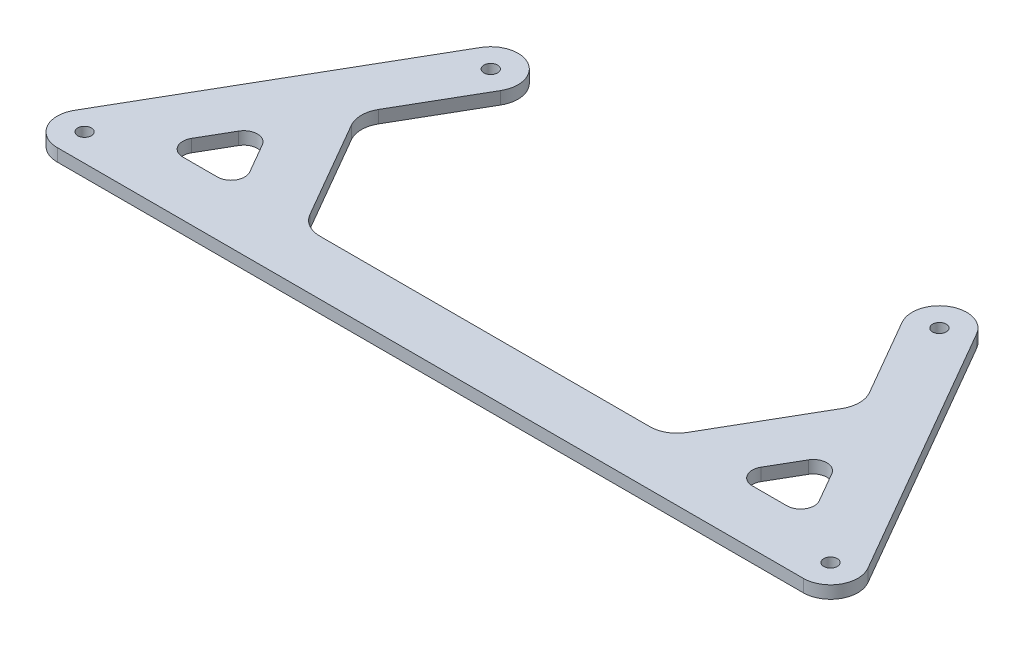
ISO-10303-21;
HEADER;
FILE_DESCRIPTION(('STEP AP214'),'2;1');
FILE_NAME('part.step','',(''),(''),'','','');
FILE_SCHEMA(('AUTOMOTIVE_DESIGN { 1 0 10303 214 1 1 1 1 }'));
ENDSEC;
DATA;
#1=APPLICATION_CONTEXT('core data for automotive mechanical design processes');
#2=APPLICATION_PROTOCOL_DEFINITION('international standard','automotive_design',2000,#1);
#3=PRODUCT_CONTEXT('',#1,'mechanical');
#4=PRODUCT('Part','Part','',(#3));
#5=PRODUCT_RELATED_PRODUCT_CATEGORY('part','',(#4));
#6=PRODUCT_DEFINITION_FORMATION('','',#4);
#7=PRODUCT_DEFINITION_CONTEXT('part definition',#1,'design');
#8=PRODUCT_DEFINITION('design','',#6,#7);
#9=PRODUCT_DEFINITION_SHAPE('','',#8);
#10=(LENGTH_UNIT() NAMED_UNIT(*) SI_UNIT(.MILLI.,.METRE.));
#11=(NAMED_UNIT(*) PLANE_ANGLE_UNIT() SI_UNIT($,.RADIAN.));
#12=(NAMED_UNIT(*) SI_UNIT($,.STERADIAN.) SOLID_ANGLE_UNIT());
#13=UNCERTAINTY_MEASURE_WITH_UNIT(LENGTH_MEASURE(1.E-05),#10,'distance_accuracy_value','');
#14=(GEOMETRIC_REPRESENTATION_CONTEXT(3) GLOBAL_UNCERTAINTY_ASSIGNED_CONTEXT((#13)) GLOBAL_UNIT_ASSIGNED_CONTEXT((#10,
#11,#12)) REPRESENTATION_CONTEXT('',''));
#15=CARTESIAN_POINT('',(0.,0.,0.));
#16=DIRECTION('',(0.,0.,1.));
#17=DIRECTION('',(1.,0.,0.));
#18=AXIS2_PLACEMENT_3D('',#15,#16,#17);
#19=CARTESIAN_POINT('',(173.5081112,5.842,0.));
#20=DIRECTION('',(0.,-1.,0.));
#21=DIRECTION('',(0.,0.,-1.));
#22=AXIS2_PLACEMENT_3D('',#19,#20,#21);
#23=PLANE('',#22);
#24=DIRECTION('',(-0.499999999999978,0.,-0.866025403784452));
#25=VECTOR('',#24,1.);
#26=CARTESIAN_POINT('',(132.461065943876,5.842,-45.6955678841852));
#27=LINE('',#26,#25);
#28=CARTESIAN_POINT('',(146.011804629844,5.842,-22.2249999999975));
#29=VERTEX_POINT('',#28);
#30=CARTESIAN_POINT('',(137.960327257907,5.842,-36.1705678841847));
#31=VERTEX_POINT('',#30);
#32=EDGE_CURVE('E442',#29,#31,#27,.T.);
#33=ORIENTED_EDGE('',*,*,#32,.F.);
#34=CARTESIAN_POINT('',(140.512543315813,5.842,-19.0499999999977));
#35=DIRECTION('',(0.,-1.,0.));
#36=DIRECTION('',(0.,0.,-1.));
#37=AXIS2_PLACEMENT_3D('',#34,#35,#36);
#38=CIRCLE('',#37,6.35);
#39=CARTESIAN_POINT('',(140.512543315813,5.842,-12.6999999999977));
#40=VERTEX_POINT('',#39);
#41=EDGE_CURVE('E290',#29,#40,#38,.T.);
#42=ORIENTED_EDGE('',*,*,#41,.T.);
#43=DIRECTION('',(1.,0.,0.));
#44=VECTOR('',#43,1.);
#45=CARTESIAN_POINT('',(151.511065943875,5.842,-12.6999999999976));
#46=LINE('',#45,#44);
#47=CARTESIAN_POINT('',(124.409588571938,5.842,-12.6999999999978));
#48=VERTEX_POINT('',#47);
#49=EDGE_CURVE('E436',#48,#40,#46,.T.);
#50=ORIENTED_EDGE('',*,*,#49,.F.);
#51=CARTESIAN_POINT('',(124.409588571938,5.842,-19.0499999999978));
#52=DIRECTION('',(0.,-1.,0.));
#53=DIRECTION('',(0.,0.,-1.));
#54=AXIS2_PLACEMENT_3D('',#51,#52,#53);
#55=CIRCLE('',#54,6.35);
#56=CARTESIAN_POINT('',(118.910327257907,5.842,-22.2249999999978));
#57=VERTEX_POINT('',#56);
#58=EDGE_CURVE('E286',#48,#57,#55,.T.);
#59=ORIENTED_EDGE('',*,*,#58,.T.);
#60=DIRECTION('',(-0.499999999999998,0.,0.86602540378444));
#61=VECTOR('',#60,1.);
#62=CARTESIAN_POINT('',(132.461065943876,5.842,-45.6955678841852));
#63=LINE('',#62,#61);
#64=CARTESIAN_POINT('',(126.961804629844,5.842,-36.1705678841848));
#65=VERTEX_POINT('',#64);
#66=EDGE_CURVE('E452',#65,#57,#63,.T.);
#67=ORIENTED_EDGE('',*,*,#66,.F.);
#68=CARTESIAN_POINT('',(132.461065943876,5.842,-32.9955678841849));
#69=DIRECTION('',(0.,-1.,0.));
#70=DIRECTION('',(0.,0.,-1.));
#71=AXIS2_PLACEMENT_3D('',#68,#69,#70);
#72=CIRCLE('',#71,6.35);
#73=EDGE_CURVE('E282',#65,#31,#72,.T.);
#74=ORIENTED_EDGE('',*,*,#73,.T.);
#75=EDGE_LOOP('',(#33,#42,#50,#59,#67,#74));
#76=FACE_BOUND('',#75,.T.);
#77=CARTESIAN_POINT('',(173.5081112,5.842,0.));
#78=DIRECTION('',(0.,1.,0.));
#79=DIRECTION('',(0.,0.,-1.));
#80=AXIS2_PLACEMENT_3D('',#77,#78,#79);
#81=CIRCLE('',#80,12.7);
#82=CARTESIAN_POINT('',(173.5081112,5.842,12.7));
#83=VERTEX_POINT('',#82);
#84=CARTESIAN_POINT('',(184.506633828062,5.842,-6.35000000000005));
#85=VERTEX_POINT('',#84);
#86=EDGE_CURVE('E231',#83,#85,#81,.T.);
#87=ORIENTED_EDGE('',*,*,#86,.T.);
#88=DIRECTION('',(-0.500000000000004,0.,-0.866025403784436));
#89=VECTOR('',#88,1.);
#90=CARTESIAN_POINT('',(115.350561828062,5.842,-126.131830355891));
#91=LINE('',#90,#89);
#92=CARTESIAN_POINT('',(115.350561828062,5.842,-126.131830355891));
#93=VERTEX_POINT('',#92);
#94=EDGE_CURVE('E221',#85,#93,#91,.T.);
#95=ORIENTED_EDGE('',*,*,#94,.T.);
#96=CARTESIAN_POINT('',(104.352039199999,5.842,-119.781830355891));
#97=DIRECTION('',(0.,1.,0.));
#98=DIRECTION('',(0.,0.,-1.));
#99=AXIS2_PLACEMENT_3D('',#96,#97,#98);
#100=CIRCLE('',#99,12.7);
#101=CARTESIAN_POINT('',(93.3535165719371,5.842,-113.431830355891));
#102=VERTEX_POINT('',#101);
#103=EDGE_CURVE('E230',#93,#102,#100,.T.);
#104=ORIENTED_EDGE('',*,*,#103,.T.);
#105=DIRECTION('',(0.500000000000001,0.,0.866025403784438));
#106=VECTOR('',#105,1.);
#107=CARTESIAN_POINT('',(93.3535165719371,5.842,-113.431830355891));
#108=LINE('',#107,#106);
#109=CARTESIAN_POINT('',(114.130194897105,5.842,-77.4455678841852));
#110=VERTEX_POINT('',#109);
#111=EDGE_CURVE('E412',#102,#110,#108,.T.);
#112=ORIENTED_EDGE('',*,*,#111,.T.);
#113=CARTESIAN_POINT('',(103.131672269043,5.842,-71.0955678841852));
#114=DIRECTION('',(0.,-1.,0.));
#115=DIRECTION('',(0.,0.,-1.));
#116=AXIS2_PLACEMENT_3D('',#113,#114,#115);
#117=CIRCLE('',#116,12.7);
#118=CARTESIAN_POINT('',(114.130194897105,5.842,-64.7455678841852));
#119=VERTEX_POINT('',#118);
#120=EDGE_CURVE('E329',#110,#119,#117,.T.);
#121=ORIENTED_EDGE('',*,*,#120,.T.);
#122=DIRECTION('',(-0.5,0.,0.866025403784439));
#123=VECTOR('',#122,1.);
#124=CARTESIAN_POINT('',(117.796369106459,5.842,-71.0955678841852));
#125=LINE('',#124,#123);
#126=CARTESIAN_POINT('',(87.7478464783968,5.842,-19.0499999999981));
#127=VERTEX_POINT('',#126);
#128=EDGE_CURVE('E360',#119,#127,#125,.T.);
#129=ORIENTED_EDGE('',*,*,#128,.T.);
#130=CARTESIAN_POINT('',(76.7493238503344,5.842,-25.3999999999981));
#131=DIRECTION('',(0.,-1.,0.));
#132=DIRECTION('',(0.,0.,-1.));
#133=AXIS2_PLACEMENT_3D('',#130,#131,#132);
#134=CIRCLE('',#133,12.7);
#135=CARTESIAN_POINT('',(76.7493238503344,5.842,-12.6999999999981));
#136=VERTEX_POINT('',#135);
#137=EDGE_CURVE('E57',#127,#136,#134,.T.);
#138=ORIENTED_EDGE('',*,*,#137,.T.);
#139=DIRECTION('',(-1.,0.,0.));
#140=VECTOR('',#139,1.);
#141=CARTESIAN_POINT('',(-84.0816722690426,5.842,-12.6999999999981));
#142=LINE('',#141,#140);
#143=CARTESIAN_POINT('',(-76.7493238503344,5.842,-12.6999999999981));
#144=VERTEX_POINT('',#143);
#145=EDGE_CURVE('E352',#136,#144,#142,.T.);
#146=ORIENTED_EDGE('',*,*,#145,.T.);
#147=CARTESIAN_POINT('',(-76.7493238503344,5.842,-25.399999999998));
#148=DIRECTION('',(0.,-1.,0.));
#149=DIRECTION('',(0.,0.,-1.));
#150=AXIS2_PLACEMENT_3D('',#147,#148,#149);
#151=CIRCLE('',#150,12.7);
#152=CARTESIAN_POINT('',(-87.7478464783968,5.842,-19.0499999999981));
#153=VERTEX_POINT('',#152);
#154=EDGE_CURVE('E11',#144,#153,#151,.T.);
#155=ORIENTED_EDGE('',*,*,#154,.T.);
#156=DIRECTION('',(-0.5,0.,-0.866025403784439));
#157=VECTOR('',#156,1.);
#158=CARTESIAN_POINT('',(-117.796369106459,5.842,-71.0955678841852));
#159=LINE('',#158,#157);
#160=CARTESIAN_POINT('',(-114.130194897105,5.842,-64.7455678841852));
#161=VERTEX_POINT('',#160);
#162=EDGE_CURVE('E350',#153,#161,#159,.T.);
#163=ORIENTED_EDGE('',*,*,#162,.T.);
#164=CARTESIAN_POINT('',(-103.131672269043,5.842,-71.0955678841852));
#165=DIRECTION('',(0.,-1.,0.));
#166=DIRECTION('',(0.,0.,-1.));
#167=AXIS2_PLACEMENT_3D('',#164,#165,#166);
#168=CIRCLE('',#167,12.7);
#169=CARTESIAN_POINT('',(-114.130194897105,5.842,-77.4455678841852));
#170=VERTEX_POINT('',#169);
#171=EDGE_CURVE('E325',#161,#170,#168,.T.);
#172=ORIENTED_EDGE('',*,*,#171,.T.);
#173=DIRECTION('',(0.500000000000001,0.,-0.866025403784438));
#174=VECTOR('',#173,1.);
#175=CARTESIAN_POINT('',(-93.3535165719371,5.842,-113.431830355891));
#176=LINE('',#175,#174);
#177=CARTESIAN_POINT('',(-93.3535165719372,5.842,-113.431830355891));
#178=VERTEX_POINT('',#177);
#179=EDGE_CURVE('E356',#170,#178,#176,.T.);
#180=ORIENTED_EDGE('',*,*,#179,.T.);
#181=CARTESIAN_POINT('',(-104.352039199999,5.842,-119.781830355891));
#182=DIRECTION('',(0.,1.,0.));
#183=DIRECTION('',(0.,0.,1.));
#184=AXIS2_PLACEMENT_3D('',#181,#182,#183);
#185=CIRCLE('',#184,12.7);
#186=CARTESIAN_POINT('',(-115.350561828062,5.842,-126.131830355891));
#187=VERTEX_POINT('',#186);
#188=EDGE_CURVE('E358',#178,#187,#185,.T.);
#189=ORIENTED_EDGE('',*,*,#188,.T.);
#190=DIRECTION('',(-0.500000000000004,0.,0.866025403784437));
#191=VECTOR('',#190,1.);
#192=CARTESIAN_POINT('',(-115.350561828062,5.842,-126.131830355891));
#193=LINE('',#192,#191);
#194=CARTESIAN_POINT('',(-184.506633828062,5.842,-6.35000000000002));
#195=VERTEX_POINT('',#194);
#196=EDGE_CURVE('E365',#187,#195,#193,.T.);
#197=ORIENTED_EDGE('',*,*,#196,.T.);
#198=CARTESIAN_POINT('',(-173.5081112,5.842,0.));
#199=DIRECTION('',(0.,1.,0.));
#200=DIRECTION('',(0.,0.,1.));
#201=AXIS2_PLACEMENT_3D('',#198,#199,#200);
#202=CIRCLE('',#201,12.7);
#203=CARTESIAN_POINT('',(-173.5081112,5.842,12.7));
#204=VERTEX_POINT('',#203);
#205=EDGE_CURVE('E367',#195,#204,#202,.T.);
#206=ORIENTED_EDGE('',*,*,#205,.T.);
#207=DIRECTION('',(1.,0.,0.));
#208=VECTOR('',#207,1.);
#209=CARTESIAN_POINT('',(-173.5081112,5.842,12.7));
#210=LINE('',#209,#208);
#211=EDGE_CURVE('E236',#204,#83,#210,.T.);
#212=ORIENTED_EDGE('',*,*,#211,.T.);
#213=EDGE_LOOP('',(#87,#95,#104,#112,#121,#129,#138,#146,#155,#163,#172,#180,#189,#197,#206,#212));
#214=FACE_BOUND('',#213,.T.);
#215=CARTESIAN_POINT('',(-173.5081112,5.842,0.));
#216=DIRECTION('',(0.,1.,0.));
#217=DIRECTION('',(0.,0.,1.));
#218=AXIS2_PLACEMENT_3D('',#215,#216,#217);
#219=CIRCLE('',#218,3.175);
#220=CARTESIAN_POINT('',(-173.5081112,5.842,3.175));
#221=VERTEX_POINT('',#220);
#222=EDGE_CURVE('E373',#221,#221,#219,.T.);
#223=ORIENTED_EDGE('',*,*,#222,.F.);
#224=EDGE_LOOP('',(#223));
#225=FACE_BOUND('',#224,.T.);
#226=CARTESIAN_POINT('',(-104.352039199999,5.842,-119.781830355891));
#227=DIRECTION('',(0.,1.,0.));
#228=DIRECTION('',(0.,0.,1.));
#229=AXIS2_PLACEMENT_3D('',#226,#227,#228);
#230=CIRCLE('',#229,3.17500000000003);
#231=CARTESIAN_POINT('',(-104.352039199999,5.842,-116.606830355891));
#232=VERTEX_POINT('',#231);
#233=EDGE_CURVE('E430',#232,#232,#230,.T.);
#234=ORIENTED_EDGE('',*,*,#233,.F.);
#235=EDGE_LOOP('',(#234));
#236=FACE_BOUND('',#235,.T.);
#237=DIRECTION('',(-0.499999999999978,0.,0.866025403784452));
#238=VECTOR('',#237,1.);
#239=CARTESIAN_POINT('',(-132.461065943876,5.842,-45.6955678841852));
#240=LINE('',#239,#238);
#241=CARTESIAN_POINT('',(-137.960327257907,5.842,-36.1705678841847));
#242=VERTEX_POINT('',#241);
#243=CARTESIAN_POINT('',(-146.011804629844,5.842,-22.2249999999975));
#244=VERTEX_POINT('',#243);
#245=EDGE_CURVE('E460',#242,#244,#240,.T.);
#246=ORIENTED_EDGE('',*,*,#245,.F.);
#247=CARTESIAN_POINT('',(-132.461065943876,5.842,-32.9955678841848));
#248=DIRECTION('',(0.,-1.,0.));
#249=DIRECTION('',(0.,0.,-1.));
#250=AXIS2_PLACEMENT_3D('',#247,#248,#249);
#251=CIRCLE('',#250,6.35);
#252=CARTESIAN_POINT('',(-126.961804629844,5.842,-36.1705678841848));
#253=VERTEX_POINT('',#252);
#254=EDGE_CURVE('E302',#242,#253,#251,.T.);
#255=ORIENTED_EDGE('',*,*,#254,.T.);
#256=DIRECTION('',(-0.499999999999997,0.,-0.86602540378444));
#257=VECTOR('',#256,1.);
#258=CARTESIAN_POINT('',(-132.461065943876,5.842,-45.6955678841852));
#259=LINE('',#258,#257);
#260=CARTESIAN_POINT('',(-118.910327257907,5.842,-22.2249999999977));
#261=VERTEX_POINT('',#260);
#262=EDGE_CURVE('E449',#261,#253,#259,.T.);
#263=ORIENTED_EDGE('',*,*,#262,.F.);
#264=CARTESIAN_POINT('',(-124.409588571938,5.842,-19.0499999999978));
#265=DIRECTION('',(0.,-1.,0.));
#266=DIRECTION('',(0.,0.,-1.));
#267=AXIS2_PLACEMENT_3D('',#264,#265,#266);
#268=CIRCLE('',#267,6.35);
#269=CARTESIAN_POINT('',(-124.409588571938,5.842,-12.6999999999978));
#270=VERTEX_POINT('',#269);
#271=EDGE_CURVE('E294',#261,#270,#268,.T.);
#272=ORIENTED_EDGE('',*,*,#271,.T.);
#273=DIRECTION('',(1.,0.,0.));
#274=VECTOR('',#273,1.);
#275=CARTESIAN_POINT('',(-151.511065943875,5.842,-12.6999999999976));
#276=LINE('',#275,#274);
#277=CARTESIAN_POINT('',(-140.512543315813,5.842,-12.6999999999976));
#278=VERTEX_POINT('',#277);
#279=EDGE_CURVE('E470',#278,#270,#276,.T.);
#280=ORIENTED_EDGE('',*,*,#279,.F.);
#281=CARTESIAN_POINT('',(-140.512543315813,5.842,-19.0499999999976));
#282=DIRECTION('',(0.,-1.,0.));
#283=DIRECTION('',(0.,0.,-1.));
#284=AXIS2_PLACEMENT_3D('',#281,#282,#283);
#285=CIRCLE('',#284,6.35);
#286=EDGE_CURVE('E298',#278,#244,#285,.T.);
#287=ORIENTED_EDGE('',*,*,#286,.T.);
#288=EDGE_LOOP('',(#246,#255,#263,#272,#280,#287));
#289=FACE_BOUND('',#288,.T.);
#290=CARTESIAN_POINT('',(104.352039199999,5.842,-119.781830355891));
#291=DIRECTION('',(0.,1.,0.));
#292=DIRECTION('',(0.,0.,-1.));
#293=AXIS2_PLACEMENT_3D('',#290,#291,#292);
#294=CIRCLE('',#293,3.175);
#295=CARTESIAN_POINT('',(104.352039199999,5.842,-122.956830355891));
#296=VERTEX_POINT('',#295);
#297=EDGE_CURVE('E467',#296,#296,#294,.T.);
#298=ORIENTED_EDGE('',*,*,#297,.F.);
#299=EDGE_LOOP('',(#298));
#300=FACE_BOUND('',#299,.T.);
#301=CARTESIAN_POINT('',(173.5081112,5.842,0.));
#302=DIRECTION('',(0.,1.,0.));
#303=DIRECTION('',(0.,0.,-1.));
#304=AXIS2_PLACEMENT_3D('',#301,#302,#303);
#305=CIRCLE('',#304,3.17499999999996);
#306=CARTESIAN_POINT('',(173.5081112,5.842,-3.17499999999996));
#307=VERTEX_POINT('',#306);
#308=EDGE_CURVE('E478',#307,#307,#305,.T.);
#309=ORIENTED_EDGE('',*,*,#308,.F.);
#310=EDGE_LOOP('',(#309));
#311=FACE_BOUND('',#310,.T.);
#312=ADVANCED_FACE('F35',(#76,#214,#225,#236,#289,#300,#311),#23,.F.);
#313=CARTESIAN_POINT('',(173.5081112,0.,0.));
#314=DIRECTION('',(0.,-1.,0.));
#315=DIRECTION('',(0.,0.,-1.));
#316=AXIS2_PLACEMENT_3D('',#313,#314,#315);
#317=PLANE('',#316);
#318=CARTESIAN_POINT('',(104.352039199999,0.,-119.781830355891));
#319=DIRECTION('',(0.,1.,0.));
#320=DIRECTION('',(0.,0.,-1.));
#321=AXIS2_PLACEMENT_3D('',#318,#319,#320);
#322=CIRCLE('',#321,3.175);
#323=CARTESIAN_POINT('',(104.352039199999,0.,-122.956830355891));
#324=VERTEX_POINT('',#323);
#325=EDGE_CURVE('E475',#324,#324,#322,.T.);
#326=ORIENTED_EDGE('',*,*,#325,.T.);
#327=EDGE_LOOP('',(#326));
#328=FACE_BOUND('',#327,.T.);
#329=CARTESIAN_POINT('',(-173.5081112,0.,0.));
#330=DIRECTION('',(0.,1.,0.));
#331=DIRECTION('',(0.,0.,1.));
#332=AXIS2_PLACEMENT_3D('',#329,#330,#331);
#333=CIRCLE('',#332,3.175);
#334=CARTESIAN_POINT('',(-173.5081112,0.,3.175));
#335=VERTEX_POINT('',#334);
#336=EDGE_CURVE('E427',#335,#335,#333,.T.);
#337=ORIENTED_EDGE('',*,*,#336,.T.);
#338=EDGE_LOOP('',(#337));
#339=FACE_BOUND('',#338,.T.);
#340=CARTESIAN_POINT('',(173.5081112,0.,0.));
#341=DIRECTION('',(0.,1.,0.));
#342=DIRECTION('',(0.,0.,-1.));
#343=AXIS2_PLACEMENT_3D('',#340,#341,#342);
#344=CIRCLE('',#343,12.7);
#345=CARTESIAN_POINT('',(173.5081112,0.,12.7));
#346=VERTEX_POINT('',#345);
#347=CARTESIAN_POINT('',(184.506633828062,0.,-6.35000000000005));
#348=VERTEX_POINT('',#347);
#349=EDGE_CURVE('E244',#346,#348,#344,.T.);
#350=ORIENTED_EDGE('',*,*,#349,.F.);
#351=DIRECTION('',(1.,0.,0.));
#352=VECTOR('',#351,1.);
#353=CARTESIAN_POINT('',(-173.5081112,0.,12.7));
#354=LINE('',#353,#352);
#355=CARTESIAN_POINT('',(-173.5081112,0.,12.7));
#356=VERTEX_POINT('',#355);
#357=EDGE_CURVE('E240',#356,#346,#354,.T.);
#358=ORIENTED_EDGE('',*,*,#357,.F.);
#359=CARTESIAN_POINT('',(-173.5081112,0.,0.));
#360=DIRECTION('',(0.,1.,0.));
#361=DIRECTION('',(0.,0.,1.));
#362=AXIS2_PLACEMENT_3D('',#359,#360,#361);
#363=CIRCLE('',#362,12.7);
#364=CARTESIAN_POINT('',(-184.506633828062,0.,-6.35000000000002));
#365=VERTEX_POINT('',#364);
#366=EDGE_CURVE('E389',#365,#356,#363,.T.);
#367=ORIENTED_EDGE('',*,*,#366,.F.);
#368=DIRECTION('',(-0.500000000000004,0.,0.866025403784437));
#369=VECTOR('',#368,1.);
#370=CARTESIAN_POINT('',(-115.350561828062,0.,-126.131830355891));
#371=LINE('',#370,#369);
#372=CARTESIAN_POINT('',(-115.350561828062,0.,-126.131830355891));
#373=VERTEX_POINT('',#372);
#374=EDGE_CURVE('E387',#373,#365,#371,.T.);
#375=ORIENTED_EDGE('',*,*,#374,.F.);
#376=CARTESIAN_POINT('',(-104.352039199999,0.,-119.781830355891));
#377=DIRECTION('',(0.,1.,0.));
#378=DIRECTION('',(0.,0.,1.));
#379=AXIS2_PLACEMENT_3D('',#376,#377,#378);
#380=CIRCLE('',#379,12.7);
#381=CARTESIAN_POINT('',(-93.3535165719372,0.,-113.431830355891));
#382=VERTEX_POINT('',#381);
#383=EDGE_CURVE('E385',#382,#373,#380,.T.);
#384=ORIENTED_EDGE('',*,*,#383,.F.);
#385=DIRECTION('',(0.500000000000001,0.,-0.866025403784438));
#386=VECTOR('',#385,1.);
#387=CARTESIAN_POINT('',(-93.3535165719371,0.,-113.431830355891));
#388=LINE('',#387,#386);
#389=CARTESIAN_POINT('',(-114.130194897105,0.,-77.4455678841852));
#390=VERTEX_POINT('',#389);
#391=EDGE_CURVE('E383',#390,#382,#388,.T.);
#392=ORIENTED_EDGE('',*,*,#391,.F.);
#393=CARTESIAN_POINT('',(-103.131672269043,0.,-71.0955678841852));
#394=DIRECTION('',(0.,-1.,0.));
#395=DIRECTION('',(0.,0.,-1.));
#396=AXIS2_PLACEMENT_3D('',#393,#394,#395);
#397=CIRCLE('',#396,12.7);
#398=CARTESIAN_POINT('',(-114.130194897105,0.,-64.7455678841852));
#399=VERTEX_POINT('',#398);
#400=EDGE_CURVE('E323',#390,#399,#397,.F.);
#401=ORIENTED_EDGE('',*,*,#400,.T.);
#402=DIRECTION('',(-0.5,0.,-0.866025403784439));
#403=VECTOR('',#402,1.);
#404=CARTESIAN_POINT('',(-117.796369106459,0.,-71.0955678841852));
#405=LINE('',#404,#403);
#406=CARTESIAN_POINT('',(-87.7478464783968,0.,-19.0499999999981));
#407=VERTEX_POINT('',#406);
#408=EDGE_CURVE('E340',#407,#399,#405,.T.);
#409=ORIENTED_EDGE('',*,*,#408,.F.);
#410=CARTESIAN_POINT('',(-76.7493238503344,0.,-25.399999999998));
#411=DIRECTION('',(0.,-1.,0.));
#412=DIRECTION('',(0.,0.,-1.));
#413=AXIS2_PLACEMENT_3D('',#410,#411,#412);
#414=CIRCLE('',#413,12.7);
#415=CARTESIAN_POINT('',(-76.7493238503344,0.,-12.6999999999981));
#416=VERTEX_POINT('',#415);
#417=EDGE_CURVE('E43',#407,#416,#414,.F.);
#418=ORIENTED_EDGE('',*,*,#417,.T.);
#419=DIRECTION('',(-1.,0.,0.));
#420=VECTOR('',#419,1.);
#421=CARTESIAN_POINT('',(-84.0816722690426,0.,-12.6999999999981));
#422=LINE('',#421,#420);
#423=CARTESIAN_POINT('',(76.7493238503344,0.,-12.6999999999981));
#424=VERTEX_POINT('',#423);
#425=EDGE_CURVE('E338',#424,#416,#422,.T.);
#426=ORIENTED_EDGE('',*,*,#425,.F.);
#427=CARTESIAN_POINT('',(76.7493238503344,0.,-25.3999999999981));
#428=DIRECTION('',(0.,-1.,0.));
#429=DIRECTION('',(0.,0.,-1.));
#430=AXIS2_PLACEMENT_3D('',#427,#428,#429);
#431=CIRCLE('',#430,12.7);
#432=CARTESIAN_POINT('',(87.7478464783968,0.,-19.0499999999981));
#433=VERTEX_POINT('',#432);
#434=EDGE_CURVE('E331',#424,#433,#431,.F.);
#435=ORIENTED_EDGE('',*,*,#434,.T.);
#436=DIRECTION('',(-0.5,0.,0.866025403784439));
#437=VECTOR('',#436,1.);
#438=CARTESIAN_POINT('',(117.796369106459,0.,-71.0955678841852));
#439=LINE('',#438,#437);
#440=CARTESIAN_POINT('',(114.130194897105,0.,-64.7455678841852));
#441=VERTEX_POINT('',#440);
#442=EDGE_CURVE('E345',#441,#433,#439,.T.);
#443=ORIENTED_EDGE('',*,*,#442,.F.);
#444=CARTESIAN_POINT('',(103.131672269043,0.,-71.0955678841852));
#445=DIRECTION('',(0.,-1.,0.));
#446=DIRECTION('',(0.,0.,-1.));
#447=AXIS2_PLACEMENT_3D('',#444,#445,#446);
#448=CIRCLE('',#447,12.7);
#449=CARTESIAN_POINT('',(114.130194897105,0.,-77.4455678841852));
#450=VERTEX_POINT('',#449);
#451=EDGE_CURVE('E327',#441,#450,#448,.F.);
#452=ORIENTED_EDGE('',*,*,#451,.T.);
#453=DIRECTION('',(0.500000000000001,0.,0.866025403784438));
#454=VECTOR('',#453,1.);
#455=CARTESIAN_POINT('',(93.3535165719371,0.,-113.431830355891));
#456=LINE('',#455,#454);
#457=CARTESIAN_POINT('',(93.3535165719371,0.,-113.431830355891));
#458=VERTEX_POINT('',#457);
#459=EDGE_CURVE('E377',#458,#450,#456,.T.);
#460=ORIENTED_EDGE('',*,*,#459,.F.);
#461=CARTESIAN_POINT('',(104.352039199999,0.,-119.781830355891));
#462=DIRECTION('',(0.,1.,0.));
#463=DIRECTION('',(0.,0.,-1.));
#464=AXIS2_PLACEMENT_3D('',#461,#462,#463);
#465=CIRCLE('',#464,12.7);
#466=CARTESIAN_POINT('',(115.350561828062,0.,-126.131830355891));
#467=VERTEX_POINT('',#466);
#468=EDGE_CURVE('E375',#467,#458,#465,.T.);
#469=ORIENTED_EDGE('',*,*,#468,.F.);
#470=DIRECTION('',(-0.500000000000004,0.,-0.866025403784436));
#471=VECTOR('',#470,1.);
#472=CARTESIAN_POINT('',(115.350561828062,0.,-126.131830355891));
#473=LINE('',#472,#471);
#474=EDGE_CURVE('E372',#348,#467,#473,.T.);
#475=ORIENTED_EDGE('',*,*,#474,.F.);
#476=EDGE_LOOP('',(#350,#358,#367,#375,#384,#392,#401,#409,#418,#426,#435,#443,#452,#460,#469,#475));
#477=FACE_BOUND('',#476,.T.);
#478=CARTESIAN_POINT('',(-104.352039199999,0.,-119.781830355891));
#479=DIRECTION('',(0.,1.,0.));
#480=DIRECTION('',(0.,0.,1.));
#481=AXIS2_PLACEMENT_3D('',#478,#479,#480);
#482=CIRCLE('',#481,3.17500000000003);
#483=CARTESIAN_POINT('',(-104.352039199999,0.,-116.606830355891));
#484=VERTEX_POINT('',#483);
#485=EDGE_CURVE('E433',#484,#484,#482,.T.);
#486=ORIENTED_EDGE('',*,*,#485,.T.);
#487=EDGE_LOOP('',(#486));
#488=FACE_BOUND('',#487,.T.);
#489=DIRECTION('',(-0.499999999999998,0.,0.86602540378444));
#490=VECTOR('',#489,1.);
#491=CARTESIAN_POINT('',(132.461065943876,0.,-45.6955678841852));
#492=LINE('',#491,#490);
#493=CARTESIAN_POINT('',(126.961804629844,0.,-36.1705678841848));
#494=VERTEX_POINT('',#493);
#495=CARTESIAN_POINT('',(118.910327257907,0.,-22.2249999999978));
#496=VERTEX_POINT('',#495);
#497=EDGE_CURVE('E443',#494,#496,#492,.T.);
#498=ORIENTED_EDGE('',*,*,#497,.T.);
#499=CARTESIAN_POINT('',(124.409588571938,0.,-19.0499999999978));
#500=DIRECTION('',(0.,-1.,0.));
#501=DIRECTION('',(0.,0.,-1.));
#502=AXIS2_PLACEMENT_3D('',#499,#500,#501);
#503=CIRCLE('',#502,6.35);
#504=CARTESIAN_POINT('',(124.409588571938,0.,-12.6999999999978));
#505=VERTEX_POINT('',#504);
#506=EDGE_CURVE('E284',#496,#505,#503,.F.);
#507=ORIENTED_EDGE('',*,*,#506,.T.);
#508=DIRECTION('',(1.,0.,0.));
#509=VECTOR('',#508,1.);
#510=CARTESIAN_POINT('',(151.511065943875,0.,-12.6999999999976));
#511=LINE('',#510,#509);
#512=CARTESIAN_POINT('',(140.512543315813,0.,-12.6999999999977));
#513=VERTEX_POINT('',#512);
#514=EDGE_CURVE('E439',#505,#513,#511,.T.);
#515=ORIENTED_EDGE('',*,*,#514,.T.);
#516=CARTESIAN_POINT('',(140.512543315813,0.,-19.0499999999977));
#517=DIRECTION('',(0.,-1.,0.));
#518=DIRECTION('',(0.,0.,-1.));
#519=AXIS2_PLACEMENT_3D('',#516,#517,#518);
#520=CIRCLE('',#519,6.35);
#521=CARTESIAN_POINT('',(146.011804629844,0.,-22.2249999999975));
#522=VERTEX_POINT('',#521);
#523=EDGE_CURVE('E288',#513,#522,#520,.F.);
#524=ORIENTED_EDGE('',*,*,#523,.T.);
#525=DIRECTION('',(-0.499999999999978,0.,-0.866025403784452));
#526=VECTOR('',#525,1.);
#527=CARTESIAN_POINT('',(132.461065943876,0.,-45.6955678841852));
#528=LINE('',#527,#526);
#529=CARTESIAN_POINT('',(137.960327257907,0.,-36.1705678841847));
#530=VERTEX_POINT('',#529);
#531=EDGE_CURVE('E446',#522,#530,#528,.T.);
#532=ORIENTED_EDGE('',*,*,#531,.T.);
#533=CARTESIAN_POINT('',(132.461065943876,0.,-32.9955678841849));
#534=DIRECTION('',(0.,-1.,0.));
#535=DIRECTION('',(0.,0.,-1.));
#536=AXIS2_PLACEMENT_3D('',#533,#534,#535);
#537=CIRCLE('',#536,6.35);
#538=EDGE_CURVE('E280',#530,#494,#537,.F.);
#539=ORIENTED_EDGE('',*,*,#538,.T.);
#540=EDGE_LOOP('',(#498,#507,#515,#524,#532,#539));
#541=FACE_BOUND('',#540,.T.);
#542=DIRECTION('',(1.,0.,0.));
#543=VECTOR('',#542,1.);
#544=CARTESIAN_POINT('',(-151.511065943875,0.,-12.6999999999976));
#545=LINE('',#544,#543);
#546=CARTESIAN_POINT('',(-140.512543315813,0.,-12.6999999999976));
#547=VERTEX_POINT('',#546);
#548=CARTESIAN_POINT('',(-124.409588571938,0.,-12.6999999999978));
#549=VERTEX_POINT('',#548);
#550=EDGE_CURVE('E461',#547,#549,#545,.T.);
#551=ORIENTED_EDGE('',*,*,#550,.T.);
#552=CARTESIAN_POINT('',(-124.409588571938,0.,-19.0499999999978));
#553=DIRECTION('',(0.,-1.,0.));
#554=DIRECTION('',(0.,0.,-1.));
#555=AXIS2_PLACEMENT_3D('',#552,#553,#554);
#556=CIRCLE('',#555,6.35);
#557=CARTESIAN_POINT('',(-118.910327257907,0.,-22.2249999999977));
#558=VERTEX_POINT('',#557);
#559=EDGE_CURVE('E292',#549,#558,#556,.F.);
#560=ORIENTED_EDGE('',*,*,#559,.T.);
#561=DIRECTION('',(-0.499999999999997,0.,-0.86602540378444));
#562=VECTOR('',#561,1.);
#563=CARTESIAN_POINT('',(-132.461065943876,0.,-45.6955678841852));
#564=LINE('',#563,#562);
#565=CARTESIAN_POINT('',(-126.961804629844,0.,-36.1705678841848));
#566=VERTEX_POINT('',#565);
#567=EDGE_CURVE('E457',#558,#566,#564,.T.);
#568=ORIENTED_EDGE('',*,*,#567,.T.);
#569=CARTESIAN_POINT('',(-132.461065943876,0.,-32.9955678841848));
#570=DIRECTION('',(0.,-1.,0.));
#571=DIRECTION('',(0.,0.,-1.));
#572=AXIS2_PLACEMENT_3D('',#569,#570,#571);
#573=CIRCLE('',#572,6.35);
#574=CARTESIAN_POINT('',(-137.960327257907,0.,-36.1705678841847));
#575=VERTEX_POINT('',#574);
#576=EDGE_CURVE('E300',#566,#575,#573,.F.);
#577=ORIENTED_EDGE('',*,*,#576,.T.);
#578=DIRECTION('',(-0.499999999999978,0.,0.866025403784452));
#579=VECTOR('',#578,1.);
#580=CARTESIAN_POINT('',(-132.461065943876,0.,-45.6955678841852));
#581=LINE('',#580,#579);
#582=CARTESIAN_POINT('',(-146.011804629844,0.,-22.2249999999975));
#583=VERTEX_POINT('',#582);
#584=EDGE_CURVE('E464',#575,#583,#581,.T.);
#585=ORIENTED_EDGE('',*,*,#584,.T.);
#586=CARTESIAN_POINT('',(-140.512543315813,0.,-19.0499999999976));
#587=DIRECTION('',(0.,-1.,0.));
#588=DIRECTION('',(0.,0.,-1.));
#589=AXIS2_PLACEMENT_3D('',#586,#587,#588);
#590=CIRCLE('',#589,6.35);
#591=EDGE_CURVE('E296',#583,#547,#590,.F.);
#592=ORIENTED_EDGE('',*,*,#591,.T.);
#593=EDGE_LOOP('',(#551,#560,#568,#577,#585,#592));
#594=FACE_BOUND('',#593,.T.);
#595=CARTESIAN_POINT('',(173.5081112,0.,0.));
#596=DIRECTION('',(0.,1.,0.));
#597=DIRECTION('',(0.,0.,-1.));
#598=AXIS2_PLACEMENT_3D('',#595,#596,#597);
#599=CIRCLE('',#598,3.17499999999996);
#600=CARTESIAN_POINT('',(173.5081112,0.,-3.17499999999996));
#601=VERTEX_POINT('',#600);
#602=EDGE_CURVE('E481',#601,#601,#599,.T.);
#603=ORIENTED_EDGE('',*,*,#602,.T.);
#604=EDGE_LOOP('',(#603));
#605=FACE_BOUND('',#604,.T.);
#606=ADVANCED_FACE('F336',(#328,#339,#477,#488,#541,#594,#605),#317,.T.);
#607=CARTESIAN_POINT('',(173.5081112,5.842,0.));
#608=DIRECTION('',(0.,-1.,0.));
#609=DIRECTION('',(0.,0.,-1.));
#610=AXIS2_PLACEMENT_3D('',#607,#608,#609);
#611=CYLINDRICAL_SURFACE('',#610,12.7);
#612=ORIENTED_EDGE('',*,*,#349,.T.);
#613=DIRECTION('',(0.,-1.,0.));
#614=VECTOR('',#613,1.);
#615=CARTESIAN_POINT('',(184.506633828062,5.842,-6.35000000000005));
#616=LINE('',#615,#614);
#617=EDGE_CURVE('E225',#85,#348,#616,.T.);
#618=ORIENTED_EDGE('',*,*,#617,.F.);
#619=ORIENTED_EDGE('',*,*,#86,.F.);
#620=DIRECTION('',(0.,-1.,0.));
#621=VECTOR('',#620,1.);
#622=CARTESIAN_POINT('',(173.5081112,5.842,12.7));
#623=LINE('',#622,#621);
#624=EDGE_CURVE('E370',#83,#346,#623,.T.);
#625=ORIENTED_EDGE('',*,*,#624,.T.);
#626=EDGE_LOOP('',(#612,#618,#619,#625));
#627=FACE_BOUND('',#626,.T.);
#628=ADVANCED_FACE('F242',(#627),#611,.T.);
#629=CARTESIAN_POINT('',(115.350561828062,5.842,-126.131830355891));
#630=DIRECTION('',(-0.866025403784436,0.,0.500000000000004));
#631=DIRECTION('',(0.500000000000004,0.,0.866025403784436));
#632=AXIS2_PLACEMENT_3D('',#629,#630,#631);
#633=PLANE('',#632);
#634=ORIENTED_EDGE('',*,*,#474,.T.);
#635=DIRECTION('',(0.,-1.,0.));
#636=VECTOR('',#635,1.);
#637=CARTESIAN_POINT('',(115.350561828062,5.842,-126.131830355891));
#638=LINE('',#637,#636);
#639=EDGE_CURVE('E228',#93,#467,#638,.T.);
#640=ORIENTED_EDGE('',*,*,#639,.F.);
#641=ORIENTED_EDGE('',*,*,#94,.F.);
#642=ORIENTED_EDGE('',*,*,#617,.T.);
#643=EDGE_LOOP('',(#634,#640,#641,#642));
#644=FACE_BOUND('',#643,.T.);
#645=ADVANCED_FACE('F223',(#644),#633,.F.);
#646=CARTESIAN_POINT('',(104.352039199999,5.842,-119.781830355891));
#647=DIRECTION('',(0.,-1.,0.));
#648=DIRECTION('',(0.,0.,-1.));
#649=AXIS2_PLACEMENT_3D('',#646,#647,#648);
#650=CYLINDRICAL_SURFACE('',#649,12.7);
#651=ORIENTED_EDGE('',*,*,#468,.T.);
#652=DIRECTION('',(0.,-1.,0.));
#653=VECTOR('',#652,1.);
#654=CARTESIAN_POINT('',(93.3535165719371,5.842,-113.431830355891));
#655=LINE('',#654,#653);
#656=EDGE_CURVE('E249',#102,#458,#655,.T.);
#657=ORIENTED_EDGE('',*,*,#656,.F.);
#658=ORIENTED_EDGE('',*,*,#103,.F.);
#659=ORIENTED_EDGE('',*,*,#639,.T.);
#660=EDGE_LOOP('',(#651,#657,#658,#659));
#661=FACE_BOUND('',#660,.T.);
#662=ADVANCED_FACE('F531',(#661),#650,.T.);
#663=CARTESIAN_POINT('',(93.3535165719371,5.842,-113.431830355891));
#664=DIRECTION('',(0.866025403784438,0.,-0.500000000000001));
#665=DIRECTION('',(-0.500000000000001,0.,-0.866025403784438));
#666=AXIS2_PLACEMENT_3D('',#663,#664,#665);
#667=PLANE('',#666);
#668=ORIENTED_EDGE('',*,*,#459,.T.);
#669=DIRECTION('',(0.,-1.,0.));
#670=VECTOR('',#669,1.);
#671=CARTESIAN_POINT('',(114.130194897105,5.842,-77.4455678841852));
#672=LINE('',#671,#670);
#673=EDGE_CURVE('E317',#450,#110,#672,.F.);
#674=ORIENTED_EDGE('',*,*,#673,.T.);
#675=ORIENTED_EDGE('',*,*,#111,.F.);
#676=ORIENTED_EDGE('',*,*,#656,.T.);
#677=EDGE_LOOP('',(#668,#674,#675,#676));
#678=FACE_BOUND('',#677,.T.);
#679=ADVANCED_FACE('F409',(#678),#667,.F.);
#680=CARTESIAN_POINT('',(117.796369106459,5.842,-71.0955678841852));
#681=DIRECTION('',(0.866025403784439,0.,0.5));
#682=DIRECTION('',(0.5,0.,-0.866025403784439));
#683=AXIS2_PLACEMENT_3D('',#680,#681,#682);
#684=PLANE('',#683);
#685=ORIENTED_EDGE('',*,*,#128,.F.);
#686=DIRECTION('',(0.,-1.,0.));
#687=VECTOR('',#686,1.);
#688=CARTESIAN_POINT('',(114.130194897105,0.,-64.7455678841852));
#689=LINE('',#688,#687);
#690=EDGE_CURVE('E314',#119,#441,#689,.T.);
#691=ORIENTED_EDGE('',*,*,#690,.T.);
#692=ORIENTED_EDGE('',*,*,#442,.T.);
#693=DIRECTION('',(0.,-1.,0.));
#694=VECTOR('',#693,1.);
#695=CARTESIAN_POINT('',(87.7478464783968,5.842,-19.0499999999981));
#696=LINE('',#695,#694);
#697=EDGE_CURVE('E312',#433,#127,#696,.F.);
#698=ORIENTED_EDGE('',*,*,#697,.T.);
#699=EDGE_LOOP('',(#685,#691,#692,#698));
#700=FACE_BOUND('',#699,.T.);
#701=ADVANCED_FACE('F422',(#700),#684,.F.);
#702=CARTESIAN_POINT('',(-84.0816722690426,5.842,-12.6999999999981));
#703=DIRECTION('',(0.,0.,1.));
#704=DIRECTION('',(1.,0.,0.));
#705=AXIS2_PLACEMENT_3D('',#702,#703,#704);
#706=PLANE('',#705);
#707=ORIENTED_EDGE('',*,*,#145,.F.);
#708=DIRECTION('',(0.,-1.,0.));
#709=VECTOR('',#708,1.);
#710=CARTESIAN_POINT('',(76.7493238503344,0.,-12.6999999999981));
#711=LINE('',#710,#709);
#712=EDGE_CURVE('E320',#136,#424,#711,.T.);
#713=ORIENTED_EDGE('',*,*,#712,.T.);
#714=ORIENTED_EDGE('',*,*,#425,.T.);
#715=DIRECTION('',(0.,-1.,0.));
#716=VECTOR('',#715,1.);
#717=CARTESIAN_POINT('',(-76.7493238503344,5.842,-12.6999999999981));
#718=LINE('',#717,#716);
#719=EDGE_CURVE('E50',#416,#144,#718,.F.);
#720=ORIENTED_EDGE('',*,*,#719,.T.);
#721=EDGE_LOOP('',(#707,#713,#714,#720));
#722=FACE_BOUND('',#721,.T.);
#723=ADVANCED_FACE('F343',(#722),#706,.F.);
#724=CARTESIAN_POINT('',(-117.796369106459,5.842,-71.0955678841852));
#725=DIRECTION('',(-0.866025403784439,0.,0.5));
#726=DIRECTION('',(0.5,0.,0.866025403784439));
#727=AXIS2_PLACEMENT_3D('',#724,#725,#726);
#728=PLANE('',#727);
#729=ORIENTED_EDGE('',*,*,#408,.T.);
#730=DIRECTION('',(0.,-1.,0.));
#731=VECTOR('',#730,1.);
#732=CARTESIAN_POINT('',(-114.130194897105,5.842,-64.7455678841852));
#733=LINE('',#732,#731);
#734=EDGE_CURVE('E310',#399,#161,#733,.F.);
#735=ORIENTED_EDGE('',*,*,#734,.T.);
#736=ORIENTED_EDGE('',*,*,#162,.F.);
#737=DIRECTION('',(0.,-1.,0.));
#738=VECTOR('',#737,1.);
#739=CARTESIAN_POINT('',(-87.7478464783968,0.,-19.0499999999981));
#740=LINE('',#739,#738);
#741=EDGE_CURVE('E307',#153,#407,#740,.T.);
#742=ORIENTED_EDGE('',*,*,#741,.T.);
#743=EDGE_LOOP('',(#729,#735,#736,#742));
#744=FACE_BOUND('',#743,.T.);
#745=ADVANCED_FACE('F354',(#744),#728,.F.);
#746=CARTESIAN_POINT('',(-93.3535165719371,5.842,-113.431830355891));
#747=DIRECTION('',(-0.866025403784438,0.,-0.500000000000001));
#748=DIRECTION('',(-0.500000000000001,0.,0.866025403784438));
#749=AXIS2_PLACEMENT_3D('',#746,#747,#748);
#750=PLANE('',#749);
#751=ORIENTED_EDGE('',*,*,#179,.F.);
#752=DIRECTION('',(0.,-1.,0.));
#753=VECTOR('',#752,1.);
#754=CARTESIAN_POINT('',(-114.130194897105,0.,-77.4455678841852));
#755=LINE('',#754,#753);
#756=EDGE_CURVE('E304',#170,#390,#755,.T.);
#757=ORIENTED_EDGE('',*,*,#756,.T.);
#758=ORIENTED_EDGE('',*,*,#391,.T.);
#759=DIRECTION('',(0.,-1.,0.));
#760=VECTOR('',#759,1.);
#761=CARTESIAN_POINT('',(-93.3535165719372,5.842,-113.431830355891));
#762=LINE('',#761,#760);
#763=EDGE_CURVE('E402',#178,#382,#762,.T.);
#764=ORIENTED_EDGE('',*,*,#763,.F.);
#765=EDGE_LOOP('',(#751,#757,#758,#764));
#766=FACE_BOUND('',#765,.T.);
#767=ADVANCED_FACE('F518',(#766),#750,.F.);
#768=CARTESIAN_POINT('',(-104.352039199999,5.842,-119.781830355891));
#769=DIRECTION('',(0.,-1.,0.));
#770=DIRECTION('',(0.,0.,-1.));
#771=AXIS2_PLACEMENT_3D('',#768,#769,#770);
#772=CYLINDRICAL_SURFACE('',#771,12.7);
#773=ORIENTED_EDGE('',*,*,#383,.T.);
#774=DIRECTION('',(0.,-1.,0.));
#775=VECTOR('',#774,1.);
#776=CARTESIAN_POINT('',(-115.350561828062,5.842,-126.131830355891));
#777=LINE('',#776,#775);
#778=EDGE_CURVE('E399',#187,#373,#777,.T.);
#779=ORIENTED_EDGE('',*,*,#778,.F.);
#780=ORIENTED_EDGE('',*,*,#188,.F.);
#781=ORIENTED_EDGE('',*,*,#763,.T.);
#782=EDGE_LOOP('',(#773,#779,#780,#781));
#783=FACE_BOUND('',#782,.T.);
#784=ADVANCED_FACE('F514',(#783),#772,.T.);
#785=CARTESIAN_POINT('',(-115.350561828062,5.842,-126.131830355891));
#786=DIRECTION('',(0.866025403784437,0.,0.500000000000003));
#787=DIRECTION('',(0.500000000000004,0.,-0.866025403784437));
#788=AXIS2_PLACEMENT_3D('',#785,#786,#787);
#789=PLANE('',#788);
#790=ORIENTED_EDGE('',*,*,#374,.T.);
#791=DIRECTION('',(0.,-1.,0.));
#792=VECTOR('',#791,1.);
#793=CARTESIAN_POINT('',(-184.506633828062,5.842,-6.35000000000002));
#794=LINE('',#793,#792);
#795=EDGE_CURVE('E396',#195,#365,#794,.T.);
#796=ORIENTED_EDGE('',*,*,#795,.F.);
#797=ORIENTED_EDGE('',*,*,#196,.F.);
#798=ORIENTED_EDGE('',*,*,#778,.T.);
#799=EDGE_LOOP('',(#790,#796,#797,#798));
#800=FACE_BOUND('',#799,.T.);
#801=ADVANCED_FACE('F510',(#800),#789,.F.);
#802=CARTESIAN_POINT('',(-173.5081112,5.842,0.));
#803=DIRECTION('',(0.,-1.,0.));
#804=DIRECTION('',(0.,0.,-1.));
#805=AXIS2_PLACEMENT_3D('',#802,#803,#804);
#806=CYLINDRICAL_SURFACE('',#805,12.7);
#807=ORIENTED_EDGE('',*,*,#366,.T.);
#808=DIRECTION('',(0.,-1.,0.));
#809=VECTOR('',#808,1.);
#810=CARTESIAN_POINT('',(-173.5081112,5.842,12.7));
#811=LINE('',#810,#809);
#812=EDGE_CURVE('E393',#204,#356,#811,.T.);
#813=ORIENTED_EDGE('',*,*,#812,.F.);
#814=ORIENTED_EDGE('',*,*,#205,.F.);
#815=ORIENTED_EDGE('',*,*,#795,.T.);
#816=EDGE_LOOP('',(#807,#813,#814,#815));
#817=FACE_BOUND('',#816,.T.);
#818=ADVANCED_FACE('F506',(#817),#806,.T.);
#819=CARTESIAN_POINT('',(-173.5081112,5.842,12.7));
#820=DIRECTION('',(0.,0.,-1.));
#821=DIRECTION('',(-1.,0.,0.));
#822=AXIS2_PLACEMENT_3D('',#819,#820,#821);
#823=PLANE('',#822);
#824=ORIENTED_EDGE('',*,*,#357,.T.);
#825=ORIENTED_EDGE('',*,*,#624,.F.);
#826=ORIENTED_EDGE('',*,*,#211,.F.);
#827=ORIENTED_EDGE('',*,*,#812,.T.);
#828=EDGE_LOOP('',(#824,#825,#826,#827));
#829=FACE_BOUND('',#828,.T.);
#830=ADVANCED_FACE('F503',(#829),#823,.F.);
#831=CARTESIAN_POINT('',(-173.5081112,5.842,0.));
#832=DIRECTION('',(0.,-1.,0.));
#833=DIRECTION('',(0.,0.,-1.));
#834=AXIS2_PLACEMENT_3D('',#831,#832,#833);
#835=CYLINDRICAL_SURFACE('',#834,3.175);
#836=ORIENTED_EDGE('',*,*,#222,.T.);
#837=EDGE_LOOP('',(#836));
#838=FACE_BOUND('',#837,.T.);
#839=ORIENTED_EDGE('',*,*,#336,.F.);
#840=EDGE_LOOP('',(#839));
#841=FACE_BOUND('',#840,.T.);
#842=ADVANCED_FACE('F500',(#838,#841),#835,.F.);
#843=CARTESIAN_POINT('',(-104.352039199999,5.842,-119.781830355891));
#844=DIRECTION('',(0.,-1.,0.));
#845=DIRECTION('',(0.,0.,-1.));
#846=AXIS2_PLACEMENT_3D('',#843,#844,#845);
#847=CYLINDRICAL_SURFACE('',#846,3.17500000000003);
#848=ORIENTED_EDGE('',*,*,#233,.T.);
#849=EDGE_LOOP('',(#848));
#850=FACE_BOUND('',#849,.T.);
#851=ORIENTED_EDGE('',*,*,#485,.F.);
#852=EDGE_LOOP('',(#851));
#853=FACE_BOUND('',#852,.T.);
#854=ADVANCED_FACE('F738',(#850,#853),#847,.F.);
#855=CARTESIAN_POINT('',(132.461065943876,5.842,-45.6955678841852));
#856=DIRECTION('',(-0.866025403784452,0.,0.499999999999978));
#857=DIRECTION('',(0.499999999999978,0.,0.866025403784452));
#858=AXIS2_PLACEMENT_3D('',#855,#856,#857);
#859=PLANE('',#858);
#860=ORIENTED_EDGE('',*,*,#32,.T.);
#861=DIRECTION('',(0.,-1.,0.));
#862=VECTOR('',#861,1.);
#863=CARTESIAN_POINT('',(137.960327257907,0.,-36.1705678841847));
#864=LINE('',#863,#862);
#865=EDGE_CURVE('E247',#31,#530,#864,.T.);
#866=ORIENTED_EDGE('',*,*,#865,.T.);
#867=ORIENTED_EDGE('',*,*,#531,.F.);
#868=DIRECTION('',(0.,-1.,0.));
#869=VECTOR('',#868,1.);
#870=CARTESIAN_POINT('',(146.011804629844,5.842,-22.2249999999975));
#871=LINE('',#870,#869);
#872=EDGE_CURVE('E245',#522,#29,#871,.F.);
#873=ORIENTED_EDGE('',*,*,#872,.T.);
#874=EDGE_LOOP('',(#860,#866,#867,#873));
#875=FACE_BOUND('',#874,.T.);
#876=ADVANCED_FACE('F728',(#875),#859,.T.);
#877=CARTESIAN_POINT('',(132.461065943876,5.842,-45.6955678841852));
#878=DIRECTION('',(0.86602540378444,0.,0.499999999999998));
#879=DIRECTION('',(0.499999999999998,0.,-0.86602540378444));
#880=AXIS2_PLACEMENT_3D('',#877,#878,#879);
#881=PLANE('',#880);
#882=ORIENTED_EDGE('',*,*,#497,.F.);
#883=DIRECTION('',(0.,-1.,0.));
#884=VECTOR('',#883,1.);
#885=CARTESIAN_POINT('',(126.961804629844,5.842,-36.1705678841848));
#886=LINE('',#885,#884);
#887=EDGE_CURVE('E258',#494,#65,#886,.F.);
#888=ORIENTED_EDGE('',*,*,#887,.T.);
#889=ORIENTED_EDGE('',*,*,#66,.T.);
#890=DIRECTION('',(0.,-1.,0.));
#891=VECTOR('',#890,1.);
#892=CARTESIAN_POINT('',(118.910327257907,0.,-22.2249999999978));
#893=LINE('',#892,#891);
#894=EDGE_CURVE('E255',#57,#496,#893,.T.);
#895=ORIENTED_EDGE('',*,*,#894,.T.);
#896=EDGE_LOOP('',(#882,#888,#889,#895));
#897=FACE_BOUND('',#896,.T.);
#898=ADVANCED_FACE('F718',(#897),#881,.T.);
#899=CARTESIAN_POINT('',(151.511065943875,5.842,-12.6999999999976));
#900=DIRECTION('',(0.,0.,-1.));
#901=DIRECTION('',(-1.,0.,0.));
#902=AXIS2_PLACEMENT_3D('',#899,#900,#901);
#903=PLANE('',#902);
#904=ORIENTED_EDGE('',*,*,#514,.F.);
#905=DIRECTION('',(0.,-1.,0.));
#906=VECTOR('',#905,1.);
#907=CARTESIAN_POINT('',(124.409588571938,5.842,-12.6999999999978));
#908=LINE('',#907,#906);
#909=EDGE_CURVE('E263',#505,#48,#908,.F.);
#910=ORIENTED_EDGE('',*,*,#909,.T.);
#911=ORIENTED_EDGE('',*,*,#49,.T.);
#912=DIRECTION('',(0.,-1.,0.));
#913=VECTOR('',#912,1.);
#914=CARTESIAN_POINT('',(140.512543315813,0.,-12.6999999999977));
#915=LINE('',#914,#913);
#916=EDGE_CURVE('E260',#40,#513,#915,.T.);
#917=ORIENTED_EDGE('',*,*,#916,.T.);
#918=EDGE_LOOP('',(#904,#910,#911,#917));
#919=FACE_BOUND('',#918,.T.);
#920=ADVANCED_FACE('F708',(#919),#903,.T.);
#921=CARTESIAN_POINT('',(-132.461065943876,5.842,-45.6955678841852));
#922=DIRECTION('',(0.866025403784452,0.,0.499999999999978));
#923=DIRECTION('',(0.499999999999978,0.,-0.866025403784452));
#924=AXIS2_PLACEMENT_3D('',#921,#922,#923);
#925=PLANE('',#924);
#926=ORIENTED_EDGE('',*,*,#245,.T.);
#927=DIRECTION('',(0.,-1.,0.));
#928=VECTOR('',#927,1.);
#929=CARTESIAN_POINT('',(-146.011804629844,0.,-22.2249999999975));
#930=LINE('',#929,#928);
#931=EDGE_CURVE('E277',#244,#583,#930,.T.);
#932=ORIENTED_EDGE('',*,*,#931,.T.);
#933=ORIENTED_EDGE('',*,*,#584,.F.);
#934=DIRECTION('',(0.,-1.,0.));
#935=VECTOR('',#934,1.);
#936=CARTESIAN_POINT('',(-137.960327257907,5.842,-36.1705678841847));
#937=LINE('',#936,#935);
#938=EDGE_CURVE('E275',#575,#242,#937,.F.);
#939=ORIENTED_EDGE('',*,*,#938,.T.);
#940=EDGE_LOOP('',(#926,#932,#933,#939));
#941=FACE_BOUND('',#940,.T.);
#942=ADVANCED_FACE('F698',(#941),#925,.T.);
#943=CARTESIAN_POINT('',(-151.511065943875,5.842,-12.6999999999976));
#944=DIRECTION('',(0.,0.,-1.));
#945=DIRECTION('',(-1.,0.,0.));
#946=AXIS2_PLACEMENT_3D('',#943,#944,#945);
#947=PLANE('',#946);
#948=ORIENTED_EDGE('',*,*,#279,.T.);
#949=DIRECTION('',(0.,-1.,0.));
#950=VECTOR('',#949,1.);
#951=CARTESIAN_POINT('',(-124.409588571938,0.,-12.6999999999978));
#952=LINE('',#951,#950);
#953=EDGE_CURVE('E267',#270,#549,#952,.T.);
#954=ORIENTED_EDGE('',*,*,#953,.T.);
#955=ORIENTED_EDGE('',*,*,#550,.F.);
#956=DIRECTION('',(0.,-1.,0.));
#957=VECTOR('',#956,1.);
#958=CARTESIAN_POINT('',(-140.512543315813,5.842,-12.6999999999976));
#959=LINE('',#958,#957);
#960=EDGE_CURVE('E265',#547,#278,#959,.F.);
#961=ORIENTED_EDGE('',*,*,#960,.T.);
#962=EDGE_LOOP('',(#948,#954,#955,#961));
#963=FACE_BOUND('',#962,.T.);
#964=ADVANCED_FACE('F686',(#963),#947,.T.);
#965=CARTESIAN_POINT('',(-132.461065943876,5.842,-45.6955678841852));
#966=DIRECTION('',(-0.86602540378444,0.,0.499999999999997));
#967=DIRECTION('',(0.499999999999997,0.,0.86602540378444));
#968=AXIS2_PLACEMENT_3D('',#965,#966,#967);
#969=PLANE('',#968);
#970=ORIENTED_EDGE('',*,*,#567,.F.);
#971=DIRECTION('',(0.,-1.,0.));
#972=VECTOR('',#971,1.);
#973=CARTESIAN_POINT('',(-118.910327257907,5.842,-22.2249999999977));
#974=LINE('',#973,#972);
#975=EDGE_CURVE('E273',#558,#261,#974,.F.);
#976=ORIENTED_EDGE('',*,*,#975,.T.);
#977=ORIENTED_EDGE('',*,*,#262,.T.);
#978=DIRECTION('',(0.,-1.,0.));
#979=VECTOR('',#978,1.);
#980=CARTESIAN_POINT('',(-126.961804629844,0.,-36.1705678841848));
#981=LINE('',#980,#979);
#982=EDGE_CURVE('E270',#253,#566,#981,.T.);
#983=ORIENTED_EDGE('',*,*,#982,.T.);
#984=EDGE_LOOP('',(#970,#976,#977,#983));
#985=FACE_BOUND('',#984,.T.);
#986=ADVANCED_FACE('F680',(#985),#969,.T.);
#987=CARTESIAN_POINT('',(104.352039199999,5.842,-119.781830355891));
#988=DIRECTION('',(0.,-1.,0.));
#989=DIRECTION('',(0.,0.,-1.));
#990=AXIS2_PLACEMENT_3D('',#987,#988,#989);
#991=CYLINDRICAL_SURFACE('',#990,3.175);
#992=ORIENTED_EDGE('',*,*,#297,.T.);
#993=EDGE_LOOP('',(#992));
#994=FACE_BOUND('',#993,.T.);
#995=ORIENTED_EDGE('',*,*,#325,.F.);
#996=EDGE_LOOP('',(#995));
#997=FACE_BOUND('',#996,.T.);
#998=ADVANCED_FACE('F685',(#994,#997),#991,.F.);
#999=CARTESIAN_POINT('',(173.5081112,5.842,0.));
#1000=DIRECTION('',(0.,-1.,0.));
#1001=DIRECTION('',(0.,0.,-1.));
#1002=AXIS2_PLACEMENT_3D('',#999,#1000,#1001);
#1003=CYLINDRICAL_SURFACE('',#1002,3.17499999999996);
#1004=ORIENTED_EDGE('',*,*,#308,.T.);
#1005=EDGE_LOOP('',(#1004));
#1006=FACE_BOUND('',#1005,.T.);
#1007=ORIENTED_EDGE('',*,*,#602,.F.);
#1008=EDGE_LOOP('',(#1007));
#1009=FACE_BOUND('',#1008,.T.);
#1010=ADVANCED_FACE('F487',(#1006,#1009),#1003,.F.);
#1011=CARTESIAN_POINT('',(132.461065943876,5.842,-32.9955678841849));
#1012=DIRECTION('',(0.,1.,0.));
#1013=DIRECTION('',(0.,0.,1.));
#1014=AXIS2_PLACEMENT_3D('',#1011,#1012,#1013);
#1015=CYLINDRICAL_SURFACE('',#1014,6.35);
#1016=ORIENTED_EDGE('',*,*,#73,.F.);
#1017=ORIENTED_EDGE('',*,*,#887,.F.);
#1018=ORIENTED_EDGE('',*,*,#538,.F.);
#1019=ORIENTED_EDGE('',*,*,#865,.F.);
#1020=EDGE_LOOP('',(#1016,#1017,#1018,#1019));
#1021=FACE_BOUND('',#1020,.T.);
#1022=ADVANCED_FACE('F538',(#1021),#1015,.F.);
#1023=CARTESIAN_POINT('',(124.409588571938,5.842,-19.0499999999978));
#1024=DIRECTION('',(0.,1.,0.));
#1025=DIRECTION('',(0.,0.,1.));
#1026=AXIS2_PLACEMENT_3D('',#1023,#1024,#1025);
#1027=CYLINDRICAL_SURFACE('',#1026,6.35);
#1028=ORIENTED_EDGE('',*,*,#58,.F.);
#1029=ORIENTED_EDGE('',*,*,#909,.F.);
#1030=ORIENTED_EDGE('',*,*,#506,.F.);
#1031=ORIENTED_EDGE('',*,*,#894,.F.);
#1032=EDGE_LOOP('',(#1028,#1029,#1030,#1031));
#1033=FACE_BOUND('',#1032,.T.);
#1034=ADVANCED_FACE('F541',(#1033),#1027,.F.);
#1035=CARTESIAN_POINT('',(140.512543315813,5.842,-19.0499999999977));
#1036=DIRECTION('',(0.,1.,0.));
#1037=DIRECTION('',(0.,0.,1.));
#1038=AXIS2_PLACEMENT_3D('',#1035,#1036,#1037);
#1039=CYLINDRICAL_SURFACE('',#1038,6.35);
#1040=ORIENTED_EDGE('',*,*,#41,.F.);
#1041=ORIENTED_EDGE('',*,*,#872,.F.);
#1042=ORIENTED_EDGE('',*,*,#523,.F.);
#1043=ORIENTED_EDGE('',*,*,#916,.F.);
#1044=EDGE_LOOP('',(#1040,#1041,#1042,#1043));
#1045=FACE_BOUND('',#1044,.T.);
#1046=ADVANCED_FACE('F545',(#1045),#1039,.F.);
#1047=CARTESIAN_POINT('',(-124.409588571938,5.842,-19.0499999999978));
#1048=DIRECTION('',(0.,1.,0.));
#1049=DIRECTION('',(0.,0.,1.));
#1050=AXIS2_PLACEMENT_3D('',#1047,#1048,#1049);
#1051=CYLINDRICAL_SURFACE('',#1050,6.35);
#1052=ORIENTED_EDGE('',*,*,#271,.F.);
#1053=ORIENTED_EDGE('',*,*,#975,.F.);
#1054=ORIENTED_EDGE('',*,*,#559,.F.);
#1055=ORIENTED_EDGE('',*,*,#953,.F.);
#1056=EDGE_LOOP('',(#1052,#1053,#1054,#1055));
#1057=FACE_BOUND('',#1056,.T.);
#1058=ADVANCED_FACE('F549',(#1057),#1051,.F.);
#1059=CARTESIAN_POINT('',(-140.512543315813,5.842,-19.0499999999976));
#1060=DIRECTION('',(0.,1.,0.));
#1061=DIRECTION('',(0.,0.,1.));
#1062=AXIS2_PLACEMENT_3D('',#1059,#1060,#1061);
#1063=CYLINDRICAL_SURFACE('',#1062,6.35);
#1064=ORIENTED_EDGE('',*,*,#286,.F.);
#1065=ORIENTED_EDGE('',*,*,#960,.F.);
#1066=ORIENTED_EDGE('',*,*,#591,.F.);
#1067=ORIENTED_EDGE('',*,*,#931,.F.);
#1068=EDGE_LOOP('',(#1064,#1065,#1066,#1067));
#1069=FACE_BOUND('',#1068,.T.);
#1070=ADVANCED_FACE('F553',(#1069),#1063,.F.);
#1071=CARTESIAN_POINT('',(-132.461065943876,5.842,-32.9955678841848));
#1072=DIRECTION('',(0.,1.,0.));
#1073=DIRECTION('',(0.,0.,1.));
#1074=AXIS2_PLACEMENT_3D('',#1071,#1072,#1073);
#1075=CYLINDRICAL_SURFACE('',#1074,6.35);
#1076=ORIENTED_EDGE('',*,*,#254,.F.);
#1077=ORIENTED_EDGE('',*,*,#938,.F.);
#1078=ORIENTED_EDGE('',*,*,#576,.F.);
#1079=ORIENTED_EDGE('',*,*,#982,.F.);
#1080=EDGE_LOOP('',(#1076,#1077,#1078,#1079));
#1081=FACE_BOUND('',#1080,.T.);
#1082=ADVANCED_FACE('F557',(#1081),#1075,.F.);
#1083=CARTESIAN_POINT('',(-103.131672269043,5.842,-71.0955678841852));
#1084=DIRECTION('',(0.,1.,0.));
#1085=DIRECTION('',(0.,0.,1.));
#1086=AXIS2_PLACEMENT_3D('',#1083,#1084,#1085);
#1087=CYLINDRICAL_SURFACE('',#1086,12.7);
#1088=ORIENTED_EDGE('',*,*,#171,.F.);
#1089=ORIENTED_EDGE('',*,*,#734,.F.);
#1090=ORIENTED_EDGE('',*,*,#400,.F.);
#1091=ORIENTED_EDGE('',*,*,#756,.F.);
#1092=EDGE_LOOP('',(#1088,#1089,#1090,#1091));
#1093=FACE_BOUND('',#1092,.T.);
#1094=ADVANCED_FACE('F561',(#1093),#1087,.F.);
#1095=CARTESIAN_POINT('',(103.131672269043,5.842,-71.0955678841852));
#1096=DIRECTION('',(0.,1.,0.));
#1097=DIRECTION('',(0.,0.,1.));
#1098=AXIS2_PLACEMENT_3D('',#1095,#1096,#1097);
#1099=CYLINDRICAL_SURFACE('',#1098,12.7);
#1100=ORIENTED_EDGE('',*,*,#120,.F.);
#1101=ORIENTED_EDGE('',*,*,#673,.F.);
#1102=ORIENTED_EDGE('',*,*,#451,.F.);
#1103=ORIENTED_EDGE('',*,*,#690,.F.);
#1104=EDGE_LOOP('',(#1100,#1101,#1102,#1103));
#1105=FACE_BOUND('',#1104,.T.);
#1106=ADVANCED_FACE('F419',(#1105),#1099,.F.);
#1107=CARTESIAN_POINT('',(76.7493238503344,5.842,-25.3999999999981));
#1108=DIRECTION('',(0.,1.,0.));
#1109=DIRECTION('',(0.,0.,1.));
#1110=AXIS2_PLACEMENT_3D('',#1107,#1108,#1109);
#1111=CYLINDRICAL_SURFACE('',#1110,12.7);
#1112=ORIENTED_EDGE('',*,*,#137,.F.);
#1113=ORIENTED_EDGE('',*,*,#697,.F.);
#1114=ORIENTED_EDGE('',*,*,#434,.F.);
#1115=ORIENTED_EDGE('',*,*,#712,.F.);
#1116=EDGE_LOOP('',(#1112,#1113,#1114,#1115));
#1117=FACE_BOUND('',#1116,.T.);
#1118=ADVANCED_FACE('F567',(#1117),#1111,.F.);
#1119=CARTESIAN_POINT('',(-76.7493238503344,5.842,-25.399999999998));
#1120=DIRECTION('',(0.,1.,0.));
#1121=DIRECTION('',(0.,0.,1.));
#1122=AXIS2_PLACEMENT_3D('',#1119,#1120,#1121);
#1123=CYLINDRICAL_SURFACE('',#1122,12.7);
#1124=ORIENTED_EDGE('',*,*,#154,.F.);
#1125=ORIENTED_EDGE('',*,*,#719,.F.);
#1126=ORIENTED_EDGE('',*,*,#417,.F.);
#1127=ORIENTED_EDGE('',*,*,#741,.F.);
#1128=EDGE_LOOP('',(#1124,#1125,#1126,#1127));
#1129=FACE_BOUND('',#1128,.T.);
#1130=ADVANCED_FACE('F37',(#1129),#1123,.F.);
#1131=CLOSED_SHELL('',(#312,#606,#628,#645,#662,#679,#701,#723,#745,#767,#784,#801,#818,#830,
#842,#854,#876,#898,#920,#942,#964,#986,#998,#1010,#1022,#1034,#1046,#1058,#1070,#1082,#1094,
#1106,#1118,#1130));
#1132=MANIFOLD_SOLID_BREP('B2',#1131);
#1133=ADVANCED_BREP_SHAPE_REPRESENTATION('',(#18,#1132),#14);
#1134=SHAPE_DEFINITION_REPRESENTATION(#9,#1133);
ENDSEC;
END-ISO-10303-21;
